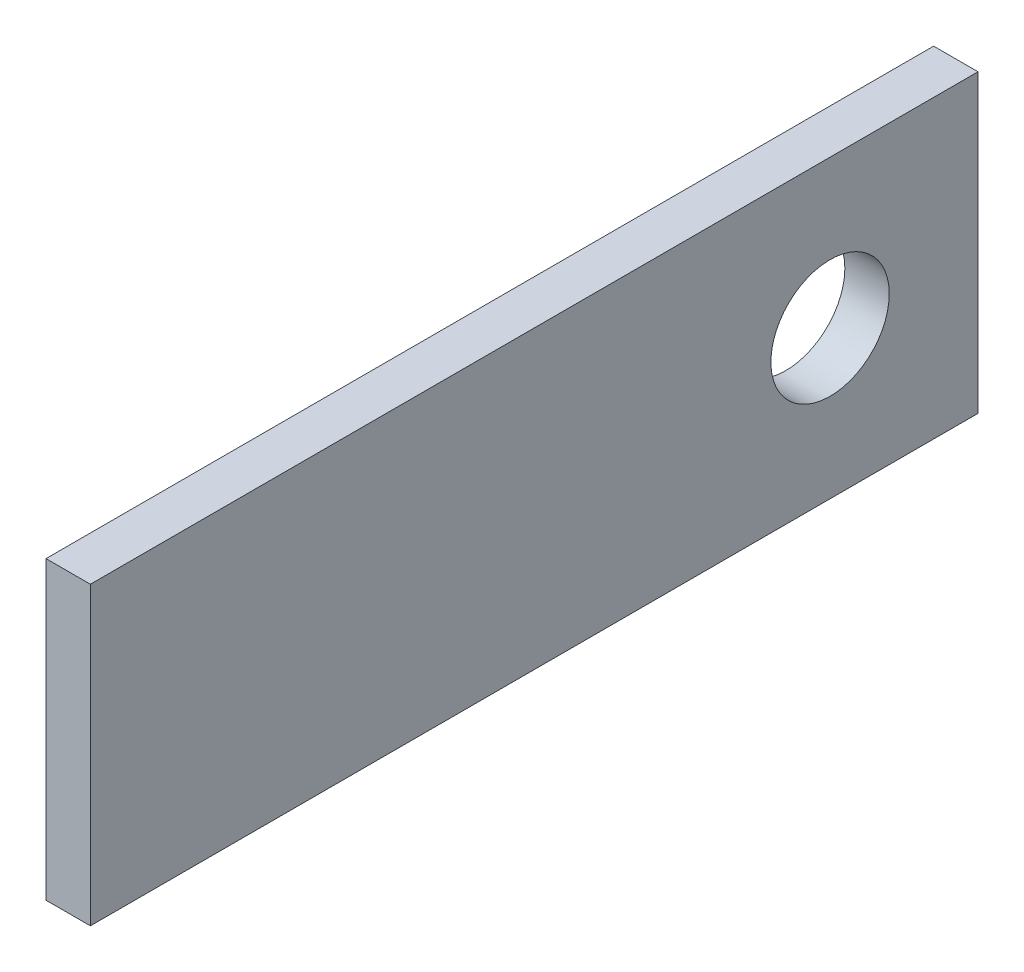
ISO-10303-21;
HEADER;
FILE_DESCRIPTION(('STEP AP214'),'2;1');
FILE_NAME('part.step','',(''),(''),'','','');
FILE_SCHEMA(('AUTOMOTIVE_DESIGN { 1 0 10303 214 1 1 1 1 }'));
ENDSEC;
DATA;
#1=APPLICATION_CONTEXT('core data for automotive mechanical design processes');
#2=APPLICATION_PROTOCOL_DEFINITION('international standard','automotive_design',2000,#1);
#3=PRODUCT_CONTEXT('',#1,'mechanical');
#4=PRODUCT('Part','Part','',(#3));
#5=PRODUCT_RELATED_PRODUCT_CATEGORY('part','',(#4));
#6=PRODUCT_DEFINITION_FORMATION('','',#4);
#7=PRODUCT_DEFINITION_CONTEXT('part definition',#1,'design');
#8=PRODUCT_DEFINITION('design','',#6,#7);
#9=PRODUCT_DEFINITION_SHAPE('','',#8);
#10=(LENGTH_UNIT() NAMED_UNIT(*) SI_UNIT(.MILLI.,.METRE.));
#11=(NAMED_UNIT(*) PLANE_ANGLE_UNIT() SI_UNIT($,.RADIAN.));
#12=(NAMED_UNIT(*) SI_UNIT($,.STERADIAN.) SOLID_ANGLE_UNIT());
#13=UNCERTAINTY_MEASURE_WITH_UNIT(LENGTH_MEASURE(1.E-05),#10,'distance_accuracy_value','');
#14=(GEOMETRIC_REPRESENTATION_CONTEXT(3) GLOBAL_UNCERTAINTY_ASSIGNED_CONTEXT((#13)) GLOBAL_UNIT_ASSIGNED_CONTEXT((#10,
#11,#12)) REPRESENTATION_CONTEXT('',''));
#15=CARTESIAN_POINT('',(0.,0.,0.));
#16=DIRECTION('',(0.,0.,1.));
#17=DIRECTION('',(1.,0.,0.));
#18=AXIS2_PLACEMENT_3D('',#15,#16,#17);
#19=CARTESIAN_POINT('',(6.,0.,0.));
#20=DIRECTION('',(-1.,0.,0.));
#21=DIRECTION('',(0.,0.,1.));
#22=AXIS2_PLACEMENT_3D('',#19,#20,#21);
#23=PLANE('',#22);
#24=DIRECTION('',(0.,1.,0.));
#25=VECTOR('',#24,1.);
#26=CARTESIAN_POINT('',(6.,-20.,-60.));
#27=LINE('',#26,#25);
#28=CARTESIAN_POINT('',(6.,-20.,-60.));
#29=VERTEX_POINT('',#28);
#30=CARTESIAN_POINT('',(6.,20.,-60.));
#31=VERTEX_POINT('',#30);
#32=EDGE_CURVE('E85',#29,#31,#27,.T.);
#33=ORIENTED_EDGE('',*,*,#32,.T.);
#34=DIRECTION('',(0.,0.,1.));
#35=VECTOR('',#34,1.);
#36=CARTESIAN_POINT('',(6.,20.,60.));
#37=LINE('',#36,#35);
#38=CARTESIAN_POINT('',(6.,20.,60.));
#39=VERTEX_POINT('',#38);
#40=EDGE_CURVE('E80',#31,#39,#37,.T.);
#41=ORIENTED_EDGE('',*,*,#40,.T.);
#42=DIRECTION('',(0.,-1.,0.));
#43=VECTOR('',#42,1.);
#44=CARTESIAN_POINT('',(6.,-20.,60.));
#45=LINE('',#44,#43);
#46=CARTESIAN_POINT('',(6.,-20.,60.));
#47=VERTEX_POINT('',#46);
#48=EDGE_CURVE('E83',#39,#47,#45,.T.);
#49=ORIENTED_EDGE('',*,*,#48,.T.);
#50=DIRECTION('',(0.,0.,-1.));
#51=VECTOR('',#50,1.);
#52=CARTESIAN_POINT('',(6.,-20.,60.));
#53=LINE('',#52,#51);
#54=EDGE_CURVE('E50',#47,#29,#53,.T.);
#55=ORIENTED_EDGE('',*,*,#54,.T.);
#56=EDGE_LOOP('',(#33,#41,#49,#55));
#57=FACE_BOUND('',#56,.T.);
#58=CARTESIAN_POINT('',(6.,0.,-40.));
#59=DIRECTION('',(1.,0.,0.));
#60=DIRECTION('',(0.,0.,-1.));
#61=AXIS2_PLACEMENT_3D('',#58,#59,#60);
#62=CIRCLE('',#61,7.99999999999998);
#63=CARTESIAN_POINT('',(6.,0.,-48.));
#64=VERTEX_POINT('',#63);
#65=EDGE_CURVE('E100',#64,#64,#62,.T.);
#66=ORIENTED_EDGE('',*,*,#65,.F.);
#67=EDGE_LOOP('',(#66));
#68=FACE_BOUND('',#67,.T.);
#69=ADVANCED_FACE('F33',(#57,#68),#23,.F.);
#70=CARTESIAN_POINT('',(0.,0.,0.));
#71=DIRECTION('',(-1.,0.,0.));
#72=DIRECTION('',(0.,0.,1.));
#73=AXIS2_PLACEMENT_3D('',#70,#71,#72);
#74=PLANE('',#73);
#75=DIRECTION('',(0.,1.,0.));
#76=VECTOR('',#75,1.);
#77=CARTESIAN_POINT('',(0.,-20.,-60.));
#78=LINE('',#77,#76);
#79=CARTESIAN_POINT('',(0.,-20.,-60.));
#80=VERTEX_POINT('',#79);
#81=CARTESIAN_POINT('',(0.,20.,-60.));
#82=VERTEX_POINT('',#81);
#83=EDGE_CURVE('E97',#80,#82,#78,.T.);
#84=ORIENTED_EDGE('',*,*,#83,.F.);
#85=DIRECTION('',(0.,0.,-1.));
#86=VECTOR('',#85,1.);
#87=CARTESIAN_POINT('',(0.,-20.,60.));
#88=LINE('',#87,#86);
#89=CARTESIAN_POINT('',(0.,-20.,60.));
#90=VERTEX_POINT('',#89);
#91=EDGE_CURVE('E73',#90,#80,#88,.T.);
#92=ORIENTED_EDGE('',*,*,#91,.F.);
#93=DIRECTION('',(0.,-1.,0.));
#94=VECTOR('',#93,1.);
#95=CARTESIAN_POINT('',(0.,-20.,60.));
#96=LINE('',#95,#94);
#97=CARTESIAN_POINT('',(0.,20.,60.));
#98=VERTEX_POINT('',#97);
#99=EDGE_CURVE('E67',#98,#90,#96,.T.);
#100=ORIENTED_EDGE('',*,*,#99,.F.);
#101=DIRECTION('',(0.,0.,1.));
#102=VECTOR('',#101,1.);
#103=CARTESIAN_POINT('',(0.,20.,60.));
#104=LINE('',#103,#102);
#105=EDGE_CURVE('E89',#82,#98,#104,.T.);
#106=ORIENTED_EDGE('',*,*,#105,.F.);
#107=EDGE_LOOP('',(#84,#92,#100,#106));
#108=FACE_BOUND('',#107,.T.);
#109=CARTESIAN_POINT('',(0.,0.,-40.));
#110=DIRECTION('',(1.,0.,0.));
#111=DIRECTION('',(0.,0.,-1.));
#112=AXIS2_PLACEMENT_3D('',#109,#110,#111);
#113=CIRCLE('',#112,7.99999999999998);
#114=CARTESIAN_POINT('',(0.,0.,-48.));
#115=VERTEX_POINT('',#114);
#116=EDGE_CURVE('E112',#115,#115,#113,.T.);
#117=ORIENTED_EDGE('',*,*,#116,.T.);
#118=EDGE_LOOP('',(#117));
#119=FACE_BOUND('',#118,.T.);
#120=ADVANCED_FACE('F108',(#108,#119),#74,.T.);
#121=CARTESIAN_POINT('',(6.,-20.,-60.));
#122=DIRECTION('',(0.,0.,1.));
#123=DIRECTION('',(1.,0.,0.));
#124=AXIS2_PLACEMENT_3D('',#121,#122,#123);
#125=PLANE('',#124);
#126=ORIENTED_EDGE('',*,*,#83,.T.);
#127=DIRECTION('',(-1.,0.,0.));
#128=VECTOR('',#127,1.);
#129=CARTESIAN_POINT('',(6.,20.,-60.));
#130=LINE('',#129,#128);
#131=EDGE_CURVE('E11',#31,#82,#130,.T.);
#132=ORIENTED_EDGE('',*,*,#131,.F.);
#133=ORIENTED_EDGE('',*,*,#32,.F.);
#134=DIRECTION('',(-1.,0.,0.));
#135=VECTOR('',#134,1.);
#136=CARTESIAN_POINT('',(6.,-20.,-60.));
#137=LINE('',#136,#135);
#138=EDGE_CURVE('E93',#29,#80,#137,.T.);
#139=ORIENTED_EDGE('',*,*,#138,.T.);
#140=EDGE_LOOP('',(#126,#132,#133,#139));
#141=FACE_BOUND('',#140,.T.);
#142=ADVANCED_FACE('F35',(#141),#125,.F.);
#143=CARTESIAN_POINT('',(6.,20.,60.));
#144=DIRECTION('',(0.,-1.,0.));
#145=DIRECTION('',(0.,0.,-1.));
#146=AXIS2_PLACEMENT_3D('',#143,#144,#145);
#147=PLANE('',#146);
#148=ORIENTED_EDGE('',*,*,#105,.T.);
#149=DIRECTION('',(-1.,0.,0.));
#150=VECTOR('',#149,1.);
#151=CARTESIAN_POINT('',(6.,20.,60.));
#152=LINE('',#151,#150);
#153=EDGE_CURVE('E42',#39,#98,#152,.T.);
#154=ORIENTED_EDGE('',*,*,#153,.F.);
#155=ORIENTED_EDGE('',*,*,#40,.F.);
#156=ORIENTED_EDGE('',*,*,#131,.T.);
#157=EDGE_LOOP('',(#148,#154,#155,#156));
#158=FACE_BOUND('',#157,.T.);
#159=ADVANCED_FACE('F88',(#158),#147,.F.);
#160=CARTESIAN_POINT('',(6.,-20.,60.));
#161=DIRECTION('',(0.,0.,-1.));
#162=DIRECTION('',(-1.,0.,0.));
#163=AXIS2_PLACEMENT_3D('',#160,#161,#162);
#164=PLANE('',#163);
#165=ORIENTED_EDGE('',*,*,#99,.T.);
#166=DIRECTION('',(-1.,0.,0.));
#167=VECTOR('',#166,1.);
#168=CARTESIAN_POINT('',(6.,-20.,60.));
#169=LINE('',#168,#167);
#170=EDGE_CURVE('E90',#47,#90,#169,.T.);
#171=ORIENTED_EDGE('',*,*,#170,.F.);
#172=ORIENTED_EDGE('',*,*,#48,.F.);
#173=ORIENTED_EDGE('',*,*,#153,.T.);
#174=EDGE_LOOP('',(#165,#171,#172,#173));
#175=FACE_BOUND('',#174,.T.);
#176=ADVANCED_FACE('F91',(#175),#164,.F.);
#177=CARTESIAN_POINT('',(6.,-20.,60.));
#178=DIRECTION('',(0.,1.,0.));
#179=DIRECTION('',(0.,0.,1.));
#180=AXIS2_PLACEMENT_3D('',#177,#178,#179);
#181=PLANE('',#180);
#182=ORIENTED_EDGE('',*,*,#91,.T.);
#183=ORIENTED_EDGE('',*,*,#138,.F.);
#184=ORIENTED_EDGE('',*,*,#54,.F.);
#185=ORIENTED_EDGE('',*,*,#170,.T.);
#186=EDGE_LOOP('',(#182,#183,#184,#185));
#187=FACE_BOUND('',#186,.T.);
#188=ADVANCED_FACE('F105',(#187),#181,.F.);
#189=CARTESIAN_POINT('',(6.,0.,-40.));
#190=DIRECTION('',(-1.,0.,0.));
#191=DIRECTION('',(0.,0.,1.));
#192=AXIS2_PLACEMENT_3D('',#189,#190,#191);
#193=CYLINDRICAL_SURFACE('',#192,7.99999999999998);
#194=ORIENTED_EDGE('',*,*,#65,.T.);
#195=EDGE_LOOP('',(#194));
#196=FACE_BOUND('',#195,.T.);
#197=ORIENTED_EDGE('',*,*,#116,.F.);
#198=EDGE_LOOP('',(#197));
#199=FACE_BOUND('',#198,.T.);
#200=ADVANCED_FACE('F118',(#196,#199),#193,.F.);
#201=CLOSED_SHELL('',(#69,#120,#142,#159,#176,#188,#200));
#202=MANIFOLD_SOLID_BREP('B2',#201);
#203=ADVANCED_BREP_SHAPE_REPRESENTATION('',(#18,#202),#14);
#204=SHAPE_DEFINITION_REPRESENTATION(#9,#203);
ENDSEC;
END-ISO-10303-21;
